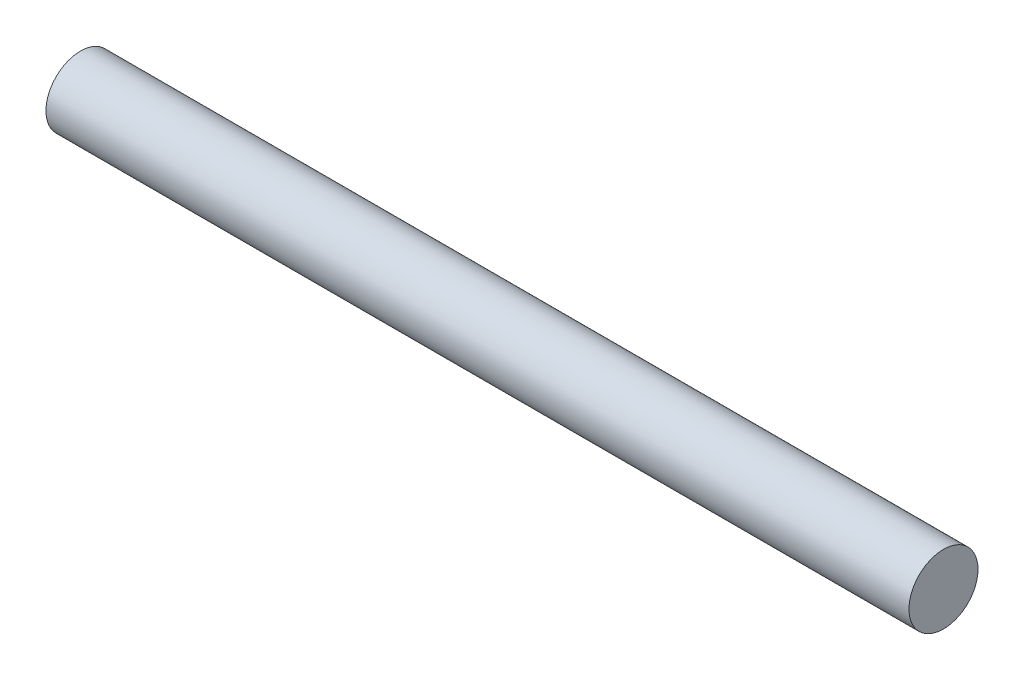
ISO-10303-21;
HEADER;
FILE_DESCRIPTION(('STEP AP214'),'2;1');
FILE_NAME('part.step','',(''),(''),'','','');
FILE_SCHEMA(('AUTOMOTIVE_DESIGN { 1 0 10303 214 1 1 1 1 }'));
ENDSEC;
DATA;
#1=APPLICATION_CONTEXT('core data for automotive mechanical design processes');
#2=APPLICATION_PROTOCOL_DEFINITION('international standard','automotive_design',2000,#1);
#3=PRODUCT_CONTEXT('',#1,'mechanical');
#4=PRODUCT('Part','Part','',(#3));
#5=PRODUCT_RELATED_PRODUCT_CATEGORY('part','',(#4));
#6=PRODUCT_DEFINITION_FORMATION('','',#4);
#7=PRODUCT_DEFINITION_CONTEXT('part definition',#1,'design');
#8=PRODUCT_DEFINITION('design','',#6,#7);
#9=PRODUCT_DEFINITION_SHAPE('','',#8);
#10=(LENGTH_UNIT() NAMED_UNIT(*) SI_UNIT(.MILLI.,.METRE.));
#11=(NAMED_UNIT(*) PLANE_ANGLE_UNIT() SI_UNIT($,.RADIAN.));
#12=(NAMED_UNIT(*) SI_UNIT($,.STERADIAN.) SOLID_ANGLE_UNIT());
#13=UNCERTAINTY_MEASURE_WITH_UNIT(LENGTH_MEASURE(1.E-05),#10,'distance_accuracy_value','');
#14=(GEOMETRIC_REPRESENTATION_CONTEXT(3) GLOBAL_UNCERTAINTY_ASSIGNED_CONTEXT((#13)) GLOBAL_UNIT_ASSIGNED_CONTEXT((#10,
#11,#12)) REPRESENTATION_CONTEXT('',''));
#15=CARTESIAN_POINT('',(0.,0.,0.));
#16=DIRECTION('',(0.,0.,1.));
#17=DIRECTION('',(1.,0.,0.));
#18=AXIS2_PLACEMENT_3D('',#15,#16,#17);
#19=CARTESIAN_POINT('',(1000.,0.,0.));
#20=DIRECTION('',(-1.,0.,0.));
#21=DIRECTION('',(0.,0.,1.));
#22=AXIS2_PLACEMENT_3D('',#19,#20,#21);
#23=CYLINDRICAL_SURFACE('',#22,40.);
#24=CARTESIAN_POINT('',(1000.,0.,0.));
#25=DIRECTION('',(1.,0.,0.));
#26=DIRECTION('',(0.,0.,-1.));
#27=AXIS2_PLACEMENT_3D('',#24,#25,#26);
#28=CIRCLE('',#27,40.);
#29=CARTESIAN_POINT('',(1000.,0.,-40.));
#30=VERTEX_POINT('',#29);
#31=EDGE_CURVE('E10',#30,#30,#28,.T.);
#32=ORIENTED_EDGE('',*,*,#31,.F.);
#33=EDGE_LOOP('',(#32));
#34=FACE_BOUND('',#33,.T.);
#35=CARTESIAN_POINT('',(0.,0.,0.));
#36=DIRECTION('',(1.,0.,0.));
#37=DIRECTION('',(0.,0.,-1.));
#38=AXIS2_PLACEMENT_3D('',#35,#36,#37);
#39=CIRCLE('',#38,40.);
#40=CARTESIAN_POINT('',(0.,0.,-40.));
#41=VERTEX_POINT('',#40);
#42=EDGE_CURVE('E44',#41,#41,#39,.T.);
#43=ORIENTED_EDGE('',*,*,#42,.T.);
#44=EDGE_LOOP('',(#43));
#45=FACE_BOUND('',#44,.T.);
#46=ADVANCED_FACE('F41',(#34,#45),#23,.T.);
#47=CARTESIAN_POINT('',(1000.,0.,0.));
#48=DIRECTION('',(1.,0.,0.));
#49=DIRECTION('',(0.,0.,-1.));
#50=AXIS2_PLACEMENT_3D('',#47,#48,#49);
#51=PLANE('',#50);
#52=ORIENTED_EDGE('',*,*,#31,.T.);
#53=EDGE_LOOP('',(#52));
#54=FACE_BOUND('',#53,.T.);
#55=ADVANCED_FACE('F58',(#54),#51,.T.);
#56=CARTESIAN_POINT('',(0.,0.,0.));
#57=DIRECTION('',(1.,0.,0.));
#58=DIRECTION('',(0.,0.,-1.));
#59=AXIS2_PLACEMENT_3D('',#56,#57,#58);
#60=PLANE('',#59);
#61=ORIENTED_EDGE('',*,*,#42,.F.);
#62=EDGE_LOOP('',(#61));
#63=FACE_BOUND('',#62,.T.);
#64=ADVANCED_FACE('F56',(#63),#60,.F.);
#65=CLOSED_SHELL('',(#46,#55,#64));
#66=MANIFOLD_SOLID_BREP('B2',#65);
#67=ADVANCED_BREP_SHAPE_REPRESENTATION('',(#18,#66),#14);
#68=SHAPE_DEFINITION_REPRESENTATION(#9,#67);
ENDSEC;
END-ISO-10303-21;
